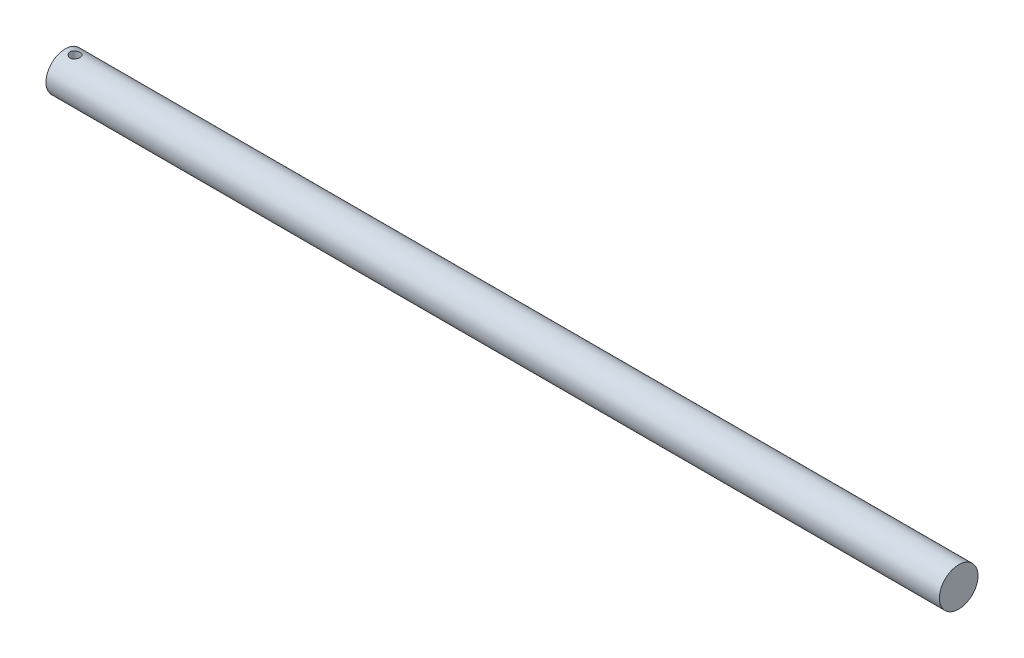
ISO-10303-21;
HEADER;
FILE_DESCRIPTION(('STEP AP214'),'2;1');
FILE_NAME('part.step','',(''),(''),'','','');
FILE_SCHEMA(('AUTOMOTIVE_DESIGN { 1 0 10303 214 1 1 1 1 }'));
ENDSEC;
DATA;
#1=APPLICATION_CONTEXT('core data for automotive mechanical design processes');
#2=APPLICATION_PROTOCOL_DEFINITION('international standard','automotive_design',2000,#1);
#3=PRODUCT_CONTEXT('',#1,'mechanical');
#4=PRODUCT('Part','Part','',(#3));
#5=PRODUCT_RELATED_PRODUCT_CATEGORY('part','',(#4));
#6=PRODUCT_DEFINITION_FORMATION('','',#4);
#7=PRODUCT_DEFINITION_CONTEXT('part definition',#1,'design');
#8=PRODUCT_DEFINITION('design','',#6,#7);
#9=PRODUCT_DEFINITION_SHAPE('','',#8);
#10=(LENGTH_UNIT() NAMED_UNIT(*) SI_UNIT(.MILLI.,.METRE.));
#11=(NAMED_UNIT(*) PLANE_ANGLE_UNIT() SI_UNIT($,.RADIAN.));
#12=(NAMED_UNIT(*) SI_UNIT($,.STERADIAN.) SOLID_ANGLE_UNIT());
#13=UNCERTAINTY_MEASURE_WITH_UNIT(LENGTH_MEASURE(1.E-05),#10,'distance_accuracy_value','');
#14=(GEOMETRIC_REPRESENTATION_CONTEXT(3) GLOBAL_UNCERTAINTY_ASSIGNED_CONTEXT((#13)) GLOBAL_UNIT_ASSIGNED_CONTEXT((#10,
#11,#12)) REPRESENTATION_CONTEXT('',''));
#15=CARTESIAN_POINT('',(0.,0.,0.));
#16=DIRECTION('',(0.,0.,1.));
#17=DIRECTION('',(1.,0.,0.));
#18=AXIS2_PLACEMENT_3D('',#15,#16,#17);
#19=CARTESIAN_POINT('',(280.710517695747,-6.55293845213727E-06,-2.03654263360549E-07));
#20=DIRECTION('',(-1.,0.,0.));
#21=DIRECTION('',(0.,0.,1.));
#22=AXIS2_PLACEMENT_3D('',#19,#20,#21);
#23=CYLINDRICAL_SURFACE('',#22,7.275);
#24=CARTESIAN_POINT('',(-54.4550323042527,-7.27500655293845,-2.03654263360549E-07));
#25=CARTESIAN_POINT('',(-54.4550295968052,-7.27500488081146,0.103489208652826));
#26=CARTESIAN_POINT('',(-54.4464354768955,-7.27277641485828,0.207008283429392));
#27=CARTESIAN_POINT('',(-54.4123418158159,-7.26410277454414,0.411072606765579));
#28=CARTESIAN_POINT('',(-54.3868333546576,-7.25765537529981,0.511616256956658));
#29=CARTESIAN_POINT('',(-54.319789162662,-7.24125675721321,0.706753975300144));
#30=CARTESIAN_POINT('',(-54.2782733292408,-7.23130988960386,0.801355260804694));
#31=CARTESIAN_POINT('',(-54.1804646051032,-7.20896795456129,0.982251432630755));
#32=CARTESIAN_POINT('',(-54.1241709913029,-7.19657276733796,1.06854591221378));
#33=CARTESIAN_POINT('',(-53.997109695041,-7.17037458213062,1.23225861601546));
#34=CARTESIAN_POINT('',(-53.9260803448946,-7.15654878273301,1.30947011262618));
#35=CARTESIAN_POINT('',(-53.772123670478,-7.12919677385942,1.45102732497266));
#36=CARTESIAN_POINT('',(-53.6891949210147,-7.11567060049402,1.51537149737397));
#37=CARTESIAN_POINT('',(-53.5121678285433,-7.09021793283671,1.63035608290763));
#38=CARTESIAN_POINT('',(-53.4179128042617,-7.07832030487861,1.68076224720215));
#39=CARTESIAN_POINT('',(-53.2219102654703,-7.05780560175872,1.76493247102546));
#40=CARTESIAN_POINT('',(-53.120164035427,-7.04918796575498,1.79869937597269));
#41=CARTESIAN_POINT('',(-52.9143480035487,-7.03644380487872,1.84792150960271));
#42=CARTESIAN_POINT('',(-52.8103732303873,-7.03222591662219,1.86374987165725));
#43=CARTESIAN_POINT('',(-52.6011651005636,-7.02848557269917,1.87780834923685));
#44=CARTESIAN_POINT('',(-52.4959319655936,-7.02896230178389,1.87604152027299));
#45=CARTESIAN_POINT('',(-52.2900779024739,-7.03447536153544,1.85525680092902));
#46=CARTESIAN_POINT('',(-52.1894080977917,-7.03939334340895,1.83668665355031));
#47=CARTESIAN_POINT('',(-51.9926633827224,-7.0530457629467,1.78353799319019));
#48=CARTESIAN_POINT('',(-51.8965888185343,-7.06178048765823,1.74895827615913));
#49=CARTESIAN_POINT('',(-51.7105765091035,-7.08218874674197,1.66439817322514));
#50=CARTESIAN_POINT('',(-51.6207149452631,-7.09389256425156,1.6142578226753));
#51=CARTESIAN_POINT('',(-51.4505219527964,-7.11890356263583,1.50011149719593));
#52=CARTESIAN_POINT('',(-51.370192291841,-7.13221103998641,1.43610295664023));
#53=CARTESIAN_POINT('',(-51.2187809965711,-7.15942566279439,1.29373160625258));
#54=CARTESIAN_POINT('',(-51.1480544562775,-7.17333874411957,1.21499179066562));
#55=CARTESIAN_POINT('',(-51.0207399341536,-7.19983328798319,1.0466007102366));
#56=CARTESIAN_POINT('',(-50.9641524392996,-7.21241470464792,0.956949069728219));
#57=CARTESIAN_POINT('',(-50.8665801646533,-7.23489750856084,0.768752856655555));
#58=CARTESIAN_POINT('',(-50.8256560627375,-7.24478843126235,0.670175493506696));
#59=CARTESIAN_POINT('',(-50.761060989245,-7.26069994313326,0.467227828084723));
#60=CARTESIAN_POINT('',(-50.7373865036362,-7.26672132056351,0.362858710352596));
#61=CARTESIAN_POINT('',(-50.7085119432718,-7.27409747616838,0.154323640212415));
#62=CARTESIAN_POINT('',(-50.702828666901,-7.27557427981983,0.0502288101332651));
#63=CARTESIAN_POINT('',(-50.7087683928433,-7.27404393974435,-0.157425468673086));
#64=CARTESIAN_POINT('',(-50.7203897325289,-7.2710372267936,-0.260984967875589));
#65=CARTESIAN_POINT('',(-50.7602113668195,-7.26095617825829,-0.462929031211463));
#66=CARTESIAN_POINT('',(-50.7881453563479,-7.25394721946526,-0.56136966945724));
#67=CARTESIAN_POINT('',(-50.8594928564471,-7.23665383818122,-0.752160644388223));
#68=CARTESIAN_POINT('',(-50.9029079849036,-7.22636907335791,-0.844510343332554));
#69=CARTESIAN_POINT('',(-51.0049034160702,-7.20337550482263,-1.02239999015099));
#70=CARTESIAN_POINT('',(-51.0637508130032,-7.1906251657951,-1.10778129568736));
#71=CARTESIAN_POINT('',(-51.1946015100599,-7.16417578915568,-1.26762766887882));
#72=CARTESIAN_POINT('',(-51.2666072306738,-7.15047657728584,-1.34209072355823));
#73=CARTESIAN_POINT('',(-51.4239796242375,-7.12322970873453,-1.47999877096844));
#74=CARTESIAN_POINT('',(-51.5096469963612,-7.10969543281899,-1.54310386738327));
#75=CARTESIAN_POINT('',(-51.6906377387917,-7.08470871870101,-1.65404571507992));
#76=CARTESIAN_POINT('',(-51.7859606888864,-7.07325618996121,-1.70188313043755));
#77=CARTESIAN_POINT('',(-51.9830586943206,-7.05385875276745,-1.78057239049559));
#78=CARTESIAN_POINT('',(-52.0847916652581,-7.04589323744294,-1.81152429713597));
#79=CARTESIAN_POINT('',(-52.2922561240861,-7.03435833880572,-1.85581638122311));
#80=CARTESIAN_POINT('',(-52.3979866651789,-7.03078792118315,-1.86916070236228));
#81=CARTESIAN_POINT('',(-52.6069767388518,-7.02852979766843,-1.87763219845147));
#82=CARTESIAN_POINT('',(-52.7102129607419,-7.02969611534956,-1.87330398216975));
#83=CARTESIAN_POINT('',(-52.9144300983139,-7.03644059215984,-1.84780739678703));
#84=CARTESIAN_POINT('',(-53.0154110649083,-7.04201865158977,-1.82663940824136));
#85=CARTESIAN_POINT('',(-53.2116165067145,-7.05687418670267,-1.76837010442699));
#86=CARTESIAN_POINT('',(-53.3068751529157,-7.06612650964352,-1.73137699220129));
#87=CARTESIAN_POINT('',(-53.4899038689732,-7.08729021786838,-1.64259228427925));
#88=CARTESIAN_POINT('',(-53.5776728342634,-7.09920199443083,-1.59079851068623));
#89=CARTESIAN_POINT('',(-53.745847862652,-7.12475348246477,-1.47220134064354));
#90=CARTESIAN_POINT('',(-53.8259836065458,-7.13843183243051,-1.4050228900098));
#91=CARTESIAN_POINT('',(-53.9740217145732,-7.16575153810093,-1.25828618038365));
#92=CARTESIAN_POINT('',(-54.0419211397481,-7.17939288414502,-1.17872495578537));
#93=CARTESIAN_POINT('',(-54.1648606800698,-7.20542067463421,-1.00760076512269));
#94=CARTESIAN_POINT('',(-54.2196229316359,-7.217777312888,-0.915833279799167));
#95=CARTESIAN_POINT('',(-54.3128561181746,-7.23952389252114,-0.724082020048864));
#96=CARTESIAN_POINT('',(-54.3513381751009,-7.24891585812473,-0.624103910716973));
#97=CARTESIAN_POINT('',(-54.405520881174,-7.26236531770881,-0.436991540163861));
#98=CARTESIAN_POINT('',(-54.424046186411,-7.26707232267502,-0.350711097881479));
#99=CARTESIAN_POINT('',(-54.4488025261032,-7.27339352041624,-0.176294240400521));
#100=CARTESIAN_POINT('',(-54.4550346106003,-7.27500797734508,-0.0881579843687966));
#101=CARTESIAN_POINT('',(-54.4550323042527,-7.27500655293845,-2.03654263360549E-07));
#102=B_SPLINE_CURVE_WITH_KNOTS('',3,(#24,#25,#26,#27,#28,#29,#30,#31,#32,#33,#34,#35,#36,#37,
#38,#39,#40,#41,#42,#43,#44,#45,#46,#47,#48,#49,#50,#51,#52,#53,#54,#55,#56,#57,#58,#59,#60,#61,
#62,#63,#64,#65,#66,#67,#68,#69,#70,#71,#72,#73,#74,#75,#76,#77,#78,#79,#80,#81,#82,#83,#84,#85,
#86,#87,#88,#89,#90,#91,#92,#93,#94,#95,#96,#97,#98,#99,#100,#101),.UNSPECIFIED.,.T.,.F.,(4,2,2,
2,2,2,2,2,2,2,2,2,2,2,2,2,2,2,2,2,2,2,2,2,2,2,2,2,2,2,2,2,2,2,2,2,2,2,4),(0.,0.310145066201004,
0.620453821481813,0.930378095142205,1.24031753637464,1.55632172879941,1.87236380074123,
2.19343279199983,2.51444685936274,2.82865348807051,3.14280555385309,3.44882551367844,
3.75486849242973,4.06416810835245,4.37352499388315,4.69228012322288,5.01104622959508,
5.3310349872357,5.6509585396353,5.962213431823,6.27343842057345,6.57971930789558,
6.88603221306638,7.19804348500637,7.51011220969187,7.83035940792571,8.15059267494038,
8.46890706601088,8.7871465329917,9.09565410542714,9.40415470622069,9.71057885079121,
10.0170481084865,10.3319820477552,10.6469915283538,10.9681698537718,11.2891284077726,
11.5533490256621,11.8175470738133),.UNSPECIFIED.);
#103=CARTESIAN_POINT('',(-54.4550323042527,-7.27500655293845,-2.03654263360549E-07));
#104=VERTEX_POINT('',#103);
#105=EDGE_CURVE('E10',#104,#104,#102,.T.);
#106=ORIENTED_EDGE('',*,*,#105,.T.);
#107=EDGE_LOOP('',(#106));
#108=FACE_BOUND('',#107,.T.);
#109=CARTESIAN_POINT('',(-52.5800323042527,7.02921815537754,1.87499979634574));
#110=CARTESIAN_POINT('',(-52.683457335946,7.02922005765175,1.87499705310411));
#111=CARTESIAN_POINT('',(-52.7869121027889,7.03152572268861,1.86641325465912));
#112=CARTESIAN_POINT('',(-52.9908430415781,7.04047387663014,1.83236430018145));
#113=CARTESIAN_POINT('',(-53.0913175586064,7.04711872961785,1.80688994169165));
#114=CARTESIAN_POINT('',(-53.2863086236766,7.06394382138469,1.73994540023466));
#115=CARTESIAN_POINT('',(-53.3808329774638,7.07411930926696,1.6984967044144));
#116=CARTESIAN_POINT('',(-53.56159873482,7.09685317134809,1.60084638477353));
#117=CARTESIAN_POINT('',(-53.6478396518537,7.10941168538738,1.54464389509847));
#118=CARTESIAN_POINT('',(-53.8116064375417,7.13582536190648,1.41767732906115));
#119=CARTESIAN_POINT('',(-53.8889100616907,7.14970229011328,1.34663106295522));
#120=CARTESIAN_POINT('',(-54.030646896629,7.17700083727911,1.19260108536852));
#121=CARTESIAN_POINT('',(-54.0950788455012,7.19042241148903,1.10961620481684));
#122=CARTESIAN_POINT('',(-54.2101605981827,7.21553976280793,0.93253362581083));
#123=CARTESIAN_POINT('',(-54.2605908768489,7.22720686386967,0.838288843228075));
#124=CARTESIAN_POINT('',(-54.3448084342389,7.24725173800646,0.642308192620768));
#125=CARTESIAN_POINT('',(-54.3785983279724,7.25563002787089,0.540573504513159));
#126=CARTESIAN_POINT('',(-54.4278606967148,7.26799938844049,0.334819163429751));
#127=CARTESIAN_POINT('',(-54.4437108778365,7.27208079233716,0.230895467105747));
#128=CARTESIAN_POINT('',(-54.4578307387424,7.27571178522412,0.0217893036011229));
#129=CARTESIAN_POINT('',(-54.4561031743892,7.27526208460721,-0.0833929636763361));
#130=CARTESIAN_POINT('',(-54.4353856501731,7.26994829914737,-0.289406648187258));
#131=CARTESIAN_POINT('',(-54.4168035596354,7.26518852010098,-0.390282180260534));
#132=CARTESIAN_POINT('',(-54.3635615784194,7.25191158312496,-0.587431925417713));
#133=CARTESIAN_POINT('',(-54.328900802851,7.24339421839791,-0.683705884932433));
#134=CARTESIAN_POINT('',(-54.2441633229259,7.22340178096838,-0.869978935407075));
#135=CARTESIAN_POINT('',(-54.1939439424928,7.21189950133551,-0.959910081533481));
#136=CARTESIAN_POINT('',(-54.0796235991042,7.18718113227831,-1.13020981689382));
#137=CARTESIAN_POINT('',(-54.0155200868762,7.17396472830174,-1.21057664581406));
#138=CARTESIAN_POINT('',(-53.873074317449,7.14680676451846,-1.36189994481301));
#139=CARTESIAN_POINT('',(-53.7943759349134,7.13285527983917,-1.43251977520212));
#140=CARTESIAN_POINT('',(-53.6261079609748,7.10614475982315,-1.55963782136821));
#141=CARTESIAN_POINT('',(-53.5365377940256,7.09338578768074,-1.61613528903021));
#142=CARTESIAN_POINT('',(-53.3483768134157,7.07046736633215,-1.71363880060699));
#143=CARTESIAN_POINT('',(-53.2497396546815,7.06032241006938,-1.75455905240562));
#144=CARTESIAN_POINT('',(-53.0466602773497,7.04396375745002,-1.81912881119501));
#145=CARTESIAN_POINT('',(-52.9422193961118,7.03774915946858,-1.84278227938105));
#146=CARTESIAN_POINT('',(-52.7336312901801,7.03014541443031,-1.871578582722));
#147=CARTESIAN_POINT('',(-52.6295577277225,7.02862602459961,-1.87722118046718));
#148=CARTESIAN_POINT('',(-52.421955142882,7.03022937069768,-1.87120776699136));
#149=CARTESIAN_POINT('',(-52.3184260678486,7.03335164918958,-1.85955346038222));
#150=CARTESIAN_POINT('',(-52.1167387276433,7.04376126556474,-1.81971636743889));
#151=CARTESIAN_POINT('',(-52.0185179286788,7.05097414081177,-1.791828846942));
#152=CARTESIAN_POINT('',(-51.8281463868806,7.06868060845915,-1.72064642452171));
#153=CARTESIAN_POINT('',(-51.7359963989977,7.07917460796292,-1.67734961060774));
#154=CARTESIAN_POINT('',(-51.5582768978232,7.10253198140334,-1.57554600099508));
#155=CARTESIAN_POINT('',(-51.4728831421017,7.11543991531344,-1.51674283813733));
#156=CARTESIAN_POINT('',(-51.3129916204229,7.14206350246756,-1.38596709243787));
#157=CARTESIAN_POINT('',(-51.238495766704,7.15577929687481,-1.31399220334883));
#158=CARTESIAN_POINT('',(-51.1004674181482,7.18291777415651,-1.15661425326052));
#159=CARTESIAN_POINT('',(-51.0372819270914,7.19632277241602,-1.07090321740555));
#160=CARTESIAN_POINT('',(-50.926198731202,7.22095058463429,-0.889798862651398));
#161=CARTESIAN_POINT('',(-50.8783002184225,7.2321735139074,-0.794406055804097));
#162=CARTESIAN_POINT('',(-50.7995783753071,7.25110097199037,-0.597313155233633));
#163=CARTESIAN_POINT('',(-50.7686297593556,7.25883124031758,-0.495665692289364));
#164=CARTESIAN_POINT('',(-50.7243155003383,7.27001535863689,-0.288385532077658));
#165=CARTESIAN_POINT('',(-50.7109462356006,7.27347008946028,-0.182753660286634));
#166=CARTESIAN_POINT('',(-50.7023845462586,7.27567534393773,0.0262452665648818));
#167=CARTESIAN_POINT('',(-50.7066814623439,7.27455803170823,0.129590314793822));
#168=CARTESIAN_POINT('',(-50.7321531848121,7.26804047194014,0.334033667681238));
#169=CARTESIAN_POINT('',(-50.7533274304718,7.2626403666908,0.435132046867141));
#170=CARTESIAN_POINT('',(-50.8116719084279,7.24818710203258,0.631641213083612));
#171=CARTESIAN_POINT('',(-50.8487446296331,7.23915623218517,0.727082698698963));
#172=CARTESIAN_POINT('',(-50.9377460126941,7.21838928396075,0.910445121443594));
#173=CARTESIAN_POINT('',(-50.9896766471613,7.20665284641918,0.998365057959464));
#174=CARTESIAN_POINT('',(-51.1084484352177,7.18136629580566,1.16659017153889));
#175=CARTESIAN_POINT('',(-51.1756324912341,7.16777791775978,1.24664749131886));
#176=CARTESIAN_POINT('',(-51.3223453016822,7.14048302388823,1.39452490668382));
#177=CARTESIAN_POINT('',(-51.4018772331189,7.12677647851871,1.46234184318229));
#178=CARTESIAN_POINT('',(-51.5729575539178,7.10048095336926,1.58516082916651));
#179=CARTESIAN_POINT('',(-51.6647158449258,7.08792006941041,1.63987701446706));
#180=CARTESIAN_POINT('',(-51.8564406489835,7.06572429630156,1.73302640301003));
#181=CARTESIAN_POINT('',(-51.9564014041912,7.05608737657978,1.77147091361692));
#182=CARTESIAN_POINT('',(-52.1434228428981,7.04226064170705,1.8255755072932));
#183=CARTESIAN_POINT('',(-52.2296257974848,7.03740775898314,1.84406781598452));
#184=CARTESIAN_POINT('',(-52.4038895352387,7.03088586124921,1.86878052941411));
#185=CARTESIAN_POINT('',(-52.4919501361201,7.0292165353013,1.87500213263383));
#186=CARTESIAN_POINT('',(-52.5800323042527,7.02921815537754,1.87499979634574));
#187=B_SPLINE_CURVE_WITH_KNOTS('',3,(#109,#110,#111,#112,#113,#114,#115,#116,#117,#118,#119,
#120,#121,#122,#123,#124,#125,#126,#127,#128,#129,#130,#131,#132,#133,#134,#135,#136,#137,#138,
#139,#140,#141,#142,#143,#144,#145,#146,#147,#148,#149,#150,#151,#152,#153,#154,#155,#156,#157,
#158,#159,#160,#161,#162,#163,#164,#165,#166,#167,#168,#169,#170,#171,#172,#173,#174,#175,#176,
#177,#178,#179,#180,#181,#182,#183,#184,#185,#186),.UNSPECIFIED.,.T.,.F.,(4,2,2,2,2,2,2,2,2,2,2,
2,2,2,2,2,2,2,2,2,2,2,2,2,2,2,2,2,2,2,2,2,2,2,2,2,2,2,4),(0.,0.309951438386989,
0.620071886040956,0.929776637151568,1.2394995679395,1.55575669151248,1.87204480519583,
2.19304292551576,2.51399058538578,2.82804736669833,3.14205491052294,3.44866066425633,
3.75528329403523,4.06480539475506,4.37438437523852,4.69285632977859,5.01134515140938,
5.33156352283867,5.65170840944885,5.96288906814417,6.27403906198696,6.57969895579638,
6.8853967892235,7.19742422619688,7.50950634864753,7.82994559116006,8.1503678950258,
8.46838867636091,8.78634392925533,9.09517393710382,9.40399368497779,9.71094582695508,
10.0179387403686,10.3326712560234,10.6474848843302,10.9686442144072,11.2895799994714,
11.553576646761,11.8175475081854),.UNSPECIFIED.);
#188=CARTESIAN_POINT('',(-52.5800323042527,7.02921815537754,1.87499979634574));
#189=VERTEX_POINT('',#188);
#190=EDGE_CURVE('E43',#189,#189,#187,.T.);
#191=ORIENTED_EDGE('',*,*,#190,.T.);
#192=EDGE_LOOP('',(#191));
#193=FACE_BOUND('',#192,.T.);
#194=CARTESIAN_POINT('',(280.710517695747,-6.55293845213727E-06,-2.03654263360549E-07));
#195=DIRECTION('',(1.,0.,0.));
#196=DIRECTION('',(0.,0.,-1.));
#197=AXIS2_PLACEMENT_3D('',#194,#195,#196);
#198=CIRCLE('',#197,7.275);
#199=CARTESIAN_POINT('',(280.710517695747,-6.55293845213727E-06,-7.27500020365426));
#200=VERTEX_POINT('',#199);
#201=EDGE_CURVE('E47',#200,#200,#198,.T.);
#202=ORIENTED_EDGE('',*,*,#201,.F.);
#203=EDGE_LOOP('',(#202));
#204=FACE_BOUND('',#203,.T.);
#205=CARTESIAN_POINT('',(-56.3300323042527,-6.55293845213727E-06,-2.03654263360549E-07));
#206=DIRECTION('',(1.,0.,0.));
#207=DIRECTION('',(0.,0.,-1.));
#208=AXIS2_PLACEMENT_3D('',#205,#206,#207);
#209=CIRCLE('',#208,7.275);
#210=CARTESIAN_POINT('',(-56.3300323042527,-6.55293845213727E-06,-7.27500020365426));
#211=VERTEX_POINT('',#210);
#212=EDGE_CURVE('E51',#211,#211,#209,.T.);
#213=ORIENTED_EDGE('',*,*,#212,.T.);
#214=EDGE_LOOP('',(#213));
#215=FACE_BOUND('',#214,.T.);
#216=ADVANCED_FACE('F32',(#108,#193,#204,#215),#23,.T.);
#217=CARTESIAN_POINT('',(280.710517695747,-6.55293845213727E-06,-2.03654263360549E-07));
#218=DIRECTION('',(1.,0.,0.));
#219=DIRECTION('',(0.,0.,-1.));
#220=AXIS2_PLACEMENT_3D('',#217,#218,#219);
#221=PLANE('',#220);
#222=ORIENTED_EDGE('',*,*,#201,.T.);
#223=EDGE_LOOP('',(#222));
#224=FACE_BOUND('',#223,.T.);
#225=ADVANCED_FACE('F63',(#224),#221,.T.);
#226=CARTESIAN_POINT('',(-56.3300323042527,-6.55293845213727E-06,-2.03654263360549E-07));
#227=DIRECTION('',(1.,0.,0.));
#228=DIRECTION('',(0.,0.,-1.));
#229=AXIS2_PLACEMENT_3D('',#226,#227,#228);
#230=PLANE('',#229);
#231=ORIENTED_EDGE('',*,*,#212,.F.);
#232=EDGE_LOOP('',(#231));
#233=FACE_BOUND('',#232,.T.);
#234=ADVANCED_FACE('F61',(#233),#230,.F.);
#235=CARTESIAN_POINT('',(-52.5800323042527,-7.27500655293845,-2.03654263360549E-07));
#236=DIRECTION('',(0.,1.,0.));
#237=DIRECTION('',(0.,0.,1.));
#238=AXIS2_PLACEMENT_3D('',#235,#236,#237);
#239=CYLINDRICAL_SURFACE('',#238,1.875);
#240=ORIENTED_EDGE('',*,*,#190,.F.);
#241=EDGE_LOOP('',(#240));
#242=FACE_BOUND('',#241,.T.);
#243=ORIENTED_EDGE('',*,*,#105,.F.);
#244=EDGE_LOOP('',(#243));
#245=FACE_BOUND('',#244,.T.);
#246=ADVANCED_FACE('F57',(#242,#245),#239,.F.);
#247=CLOSED_SHELL('',(#216,#225,#234,#246));
#248=MANIFOLD_SOLID_BREP('B2',#247);
#249=ADVANCED_BREP_SHAPE_REPRESENTATION('',(#18,#248),#14);
#250=SHAPE_DEFINITION_REPRESENTATION(#9,#249);
ENDSEC;
END-ISO-10303-21;
